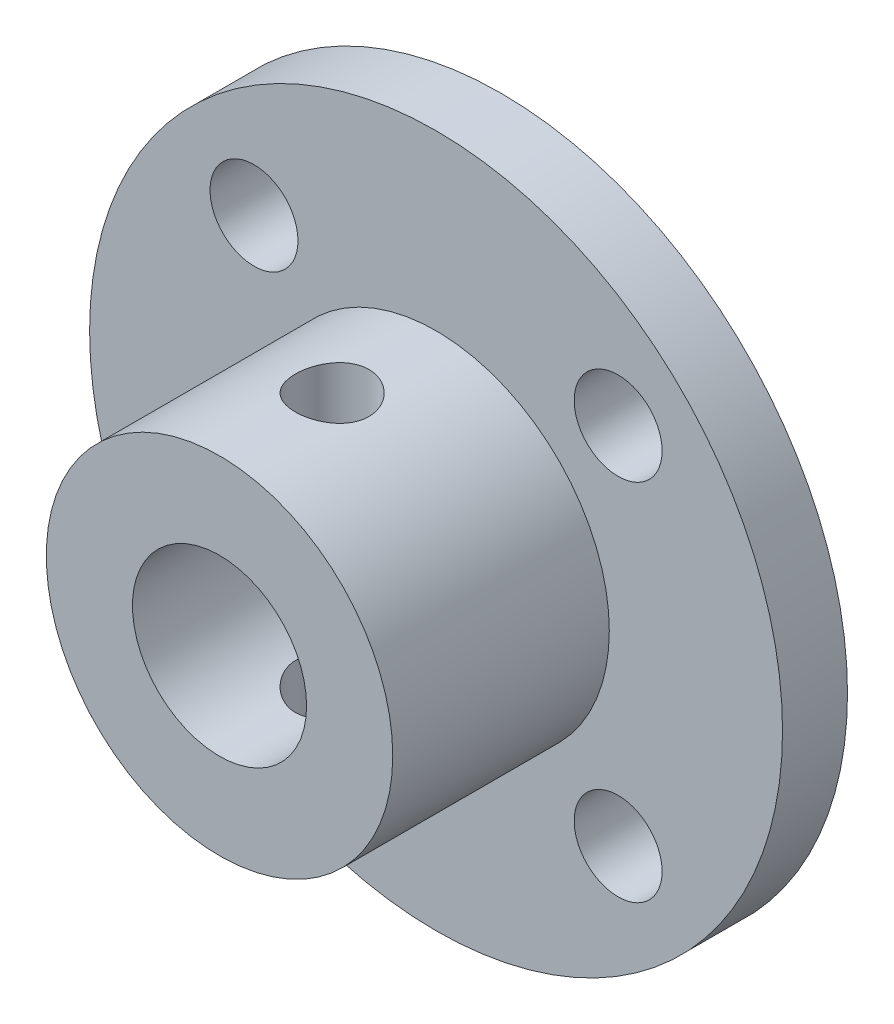
ISO-10303-21;
HEADER;
FILE_DESCRIPTION(('STEP AP214'),'2;1');
FILE_NAME('part.step','',(''),(''),'','','');
FILE_SCHEMA(('AUTOMOTIVE_DESIGN { 1 0 10303 214 1 1 1 1 }'));
ENDSEC;
DATA;
#1=APPLICATION_CONTEXT('core data for automotive mechanical design processes');
#2=APPLICATION_PROTOCOL_DEFINITION('international standard','automotive_design',2000,#1);
#3=PRODUCT_CONTEXT('',#1,'mechanical');
#4=PRODUCT('Part','Part','',(#3));
#5=PRODUCT_RELATED_PRODUCT_CATEGORY('part','',(#4));
#6=PRODUCT_DEFINITION_FORMATION('','',#4);
#7=PRODUCT_DEFINITION_CONTEXT('part definition',#1,'design');
#8=PRODUCT_DEFINITION('design','',#6,#7);
#9=PRODUCT_DEFINITION_SHAPE('','',#8);
#10=(LENGTH_UNIT() NAMED_UNIT(*) SI_UNIT(.MILLI.,.METRE.));
#11=(NAMED_UNIT(*) PLANE_ANGLE_UNIT() SI_UNIT($,.RADIAN.));
#12=(NAMED_UNIT(*) SI_UNIT($,.STERADIAN.) SOLID_ANGLE_UNIT());
#13=UNCERTAINTY_MEASURE_WITH_UNIT(LENGTH_MEASURE(1.E-05),#10,'distance_accuracy_value','');
#14=(GEOMETRIC_REPRESENTATION_CONTEXT(3) GLOBAL_UNCERTAINTY_ASSIGNED_CONTEXT((#13)) GLOBAL_UNIT_ASSIGNED_CONTEXT((#10,
#11,#12)) REPRESENTATION_CONTEXT('',''));
#15=CARTESIAN_POINT('',(0.,0.,0.));
#16=DIRECTION('',(0.,0.,1.));
#17=DIRECTION('',(1.,0.,0.));
#18=AXIS2_PLACEMENT_3D('',#15,#16,#17);
#19=CARTESIAN_POINT('',(0.,0.,3.));
#20=DIRECTION('',(0.,0.,1.));
#21=DIRECTION('',(1.,0.,0.));
#22=AXIS2_PLACEMENT_3D('',#19,#20,#21);
#23=PLANE('',#22);
#24=CARTESIAN_POINT('',(0.,0.,3.));
#25=DIRECTION('',(0.,0.,1.));
#26=DIRECTION('',(1.,0.,0.));
#27=AXIS2_PLACEMENT_3D('',#24,#25,#26);
#28=CIRCLE('',#27,8.);
#29=CARTESIAN_POINT('',(8.,0.,3.));
#30=VERTEX_POINT('',#29);
#31=EDGE_CURVE('E146',#30,#30,#28,.T.);
#32=ORIENTED_EDGE('',*,*,#31,.F.);
#33=EDGE_LOOP('',(#32));
#34=FACE_BOUND('',#33,.T.);
#35=CARTESIAN_POINT('',(8.40749962830804,-8.40749962830806,3.));
#36=DIRECTION('',(0.,0.,1.));
#37=DIRECTION('',(1.,0.,0.));
#38=AXIS2_PLACEMENT_3D('',#35,#36,#37);
#39=CIRCLE('',#38,2.03);
#40=CARTESIAN_POINT('',(10.437499628308,-8.40749962830806,3.));
#41=VERTEX_POINT('',#40);
#42=EDGE_CURVE('E150',#41,#41,#39,.T.);
#43=ORIENTED_EDGE('',*,*,#42,.F.);
#44=EDGE_LOOP('',(#43));
#45=FACE_BOUND('',#44,.T.);
#46=CARTESIAN_POINT('',(-8.40749962830804,8.40749962830806,3.));
#47=DIRECTION('',(0.,0.,1.));
#48=DIRECTION('',(1.,0.,0.));
#49=AXIS2_PLACEMENT_3D('',#46,#47,#48);
#50=CIRCLE('',#49,2.03);
#51=CARTESIAN_POINT('',(-6.37749962830804,8.40749962830806,3.));
#52=VERTEX_POINT('',#51);
#53=EDGE_CURVE('E53',#52,#52,#50,.T.);
#54=ORIENTED_EDGE('',*,*,#53,.F.);
#55=EDGE_LOOP('',(#54));
#56=FACE_BOUND('',#55,.T.);
#57=CARTESIAN_POINT('',(0.,0.,3.));
#58=DIRECTION('',(0.,0.,1.));
#59=DIRECTION('',(1.,0.,0.));
#60=AXIS2_PLACEMENT_3D('',#57,#58,#59);
#61=CIRCLE('',#60,16.);
#62=CARTESIAN_POINT('',(16.,0.,3.));
#63=VERTEX_POINT('',#62);
#64=EDGE_CURVE('E10',#63,#63,#61,.T.);
#65=ORIENTED_EDGE('',*,*,#64,.T.);
#66=EDGE_LOOP('',(#65));
#67=FACE_BOUND('',#66,.T.);
#68=CARTESIAN_POINT('',(8.40749962830806,8.40749962830804,3.));
#69=DIRECTION('',(0.,0.,1.));
#70=DIRECTION('',(1.,0.,0.));
#71=AXIS2_PLACEMENT_3D('',#68,#69,#70);
#72=CIRCLE('',#71,2.03);
#73=CARTESIAN_POINT('',(10.4374996283081,8.40749962830804,3.));
#74=VERTEX_POINT('',#73);
#75=EDGE_CURVE('E154',#74,#74,#72,.T.);
#76=ORIENTED_EDGE('',*,*,#75,.F.);
#77=EDGE_LOOP('',(#76));
#78=FACE_BOUND('',#77,.T.);
#79=CARTESIAN_POINT('',(-8.40749962830806,-8.40749962830804,3.));
#80=DIRECTION('',(0.,0.,1.));
#81=DIRECTION('',(1.,0.,0.));
#82=AXIS2_PLACEMENT_3D('',#79,#80,#81);
#83=CIRCLE('',#82,2.03);
#84=CARTESIAN_POINT('',(-6.37749962830806,-8.40749962830804,3.));
#85=VERTEX_POINT('',#84);
#86=EDGE_CURVE('E140',#85,#85,#83,.T.);
#87=ORIENTED_EDGE('',*,*,#86,.F.);
#88=EDGE_LOOP('',(#87));
#89=FACE_BOUND('',#88,.T.);
#90=ADVANCED_FACE('F35',(#34,#45,#56,#67,#78,#89),#23,.T.);
#91=CARTESIAN_POINT('',(0.,0.,0.));
#92=DIRECTION('',(0.,0.,1.));
#93=DIRECTION('',(1.,0.,0.));
#94=AXIS2_PLACEMENT_3D('',#91,#92,#93);
#95=PLANE('',#94);
#96=CARTESIAN_POINT('',(0.,0.,0.));
#97=DIRECTION('',(0.,0.,1.));
#98=DIRECTION('',(1.,0.,0.));
#99=AXIS2_PLACEMENT_3D('',#96,#97,#98);
#100=CIRCLE('',#99,4.02);
#101=CARTESIAN_POINT('',(4.02,0.,0.));
#102=VERTEX_POINT('',#101);
#103=EDGE_CURVE('E122',#102,#102,#100,.T.);
#104=ORIENTED_EDGE('',*,*,#103,.T.);
#105=EDGE_LOOP('',(#104));
#106=FACE_BOUND('',#105,.T.);
#107=CARTESIAN_POINT('',(0.,0.,0.));
#108=DIRECTION('',(0.,0.,1.));
#109=DIRECTION('',(1.,0.,0.));
#110=AXIS2_PLACEMENT_3D('',#107,#108,#109);
#111=CIRCLE('',#110,16.);
#112=CARTESIAN_POINT('',(16.,0.,0.));
#113=VERTEX_POINT('',#112);
#114=EDGE_CURVE('E48',#113,#113,#111,.T.);
#115=ORIENTED_EDGE('',*,*,#114,.F.);
#116=EDGE_LOOP('',(#115));
#117=FACE_BOUND('',#116,.T.);
#118=CARTESIAN_POINT('',(-8.40749962830804,8.40749962830806,0.));
#119=DIRECTION('',(0.,0.,1.));
#120=DIRECTION('',(1.,0.,0.));
#121=AXIS2_PLACEMENT_3D('',#118,#119,#120);
#122=CIRCLE('',#121,2.03);
#123=CARTESIAN_POINT('',(-6.37749962830804,8.40749962830806,0.));
#124=VERTEX_POINT('',#123);
#125=EDGE_CURVE('E56',#124,#124,#122,.T.);
#126=ORIENTED_EDGE('',*,*,#125,.T.);
#127=EDGE_LOOP('',(#126));
#128=FACE_BOUND('',#127,.T.);
#129=CARTESIAN_POINT('',(8.40749962830806,8.40749962830804,0.));
#130=DIRECTION('',(0.,0.,1.));
#131=DIRECTION('',(1.,0.,0.));
#132=AXIS2_PLACEMENT_3D('',#129,#130,#131);
#133=CIRCLE('',#132,2.03);
#134=CARTESIAN_POINT('',(10.4374996283081,8.40749962830804,0.));
#135=VERTEX_POINT('',#134);
#136=EDGE_CURVE('E131',#135,#135,#133,.T.);
#137=ORIENTED_EDGE('',*,*,#136,.T.);
#138=EDGE_LOOP('',(#137));
#139=FACE_BOUND('',#138,.T.);
#140=CARTESIAN_POINT('',(8.40749962830804,-8.40749962830806,0.));
#141=DIRECTION('',(0.,0.,1.));
#142=DIRECTION('',(1.,0.,0.));
#143=AXIS2_PLACEMENT_3D('',#140,#141,#142);
#144=CIRCLE('',#143,2.03);
#145=CARTESIAN_POINT('',(10.437499628308,-8.40749962830806,0.));
#146=VERTEX_POINT('',#145);
#147=EDGE_CURVE('E135',#146,#146,#144,.T.);
#148=ORIENTED_EDGE('',*,*,#147,.T.);
#149=EDGE_LOOP('',(#148));
#150=FACE_BOUND('',#149,.T.);
#151=CARTESIAN_POINT('',(-8.40749962830806,-8.40749962830804,0.));
#152=DIRECTION('',(0.,0.,1.));
#153=DIRECTION('',(1.,0.,0.));
#154=AXIS2_PLACEMENT_3D('',#151,#152,#153);
#155=CIRCLE('',#154,2.03);
#156=CARTESIAN_POINT('',(-6.37749962830806,-8.40749962830804,0.));
#157=VERTEX_POINT('',#156);
#158=EDGE_CURVE('E138',#157,#157,#155,.T.);
#159=ORIENTED_EDGE('',*,*,#158,.T.);
#160=EDGE_LOOP('',(#159));
#161=FACE_BOUND('',#160,.T.);
#162=ADVANCED_FACE('F111',(#106,#117,#128,#139,#150,#161),#95,.F.);
#163=CARTESIAN_POINT('',(0.,0.,3.));
#164=DIRECTION('',(0.,0.,-1.));
#165=DIRECTION('',(-1.,0.,0.));
#166=AXIS2_PLACEMENT_3D('',#163,#164,#165);
#167=CYLINDRICAL_SURFACE('',#166,16.);
#168=ORIENTED_EDGE('',*,*,#64,.F.);
#169=EDGE_LOOP('',(#168));
#170=FACE_BOUND('',#169,.T.);
#171=ORIENTED_EDGE('',*,*,#114,.T.);
#172=EDGE_LOOP('',(#171));
#173=FACE_BOUND('',#172,.T.);
#174=ADVANCED_FACE('F37',(#170,#173),#167,.T.);
#175=CARTESIAN_POINT('',(-8.40749962830804,8.40749962830806,3.));
#176=DIRECTION('',(0.,0.,-1.));
#177=DIRECTION('',(-1.,0.,0.));
#178=AXIS2_PLACEMENT_3D('',#175,#176,#177);
#179=CYLINDRICAL_SURFACE('',#178,2.03);
#180=ORIENTED_EDGE('',*,*,#53,.T.);
#181=EDGE_LOOP('',(#180));
#182=FACE_BOUND('',#181,.T.);
#183=ORIENTED_EDGE('',*,*,#125,.F.);
#184=EDGE_LOOP('',(#183));
#185=FACE_BOUND('',#184,.T.);
#186=ADVANCED_FACE('F105',(#182,#185),#179,.F.);
#187=CARTESIAN_POINT('',(8.40749962830806,8.40749962830804,3.));
#188=DIRECTION('',(0.,0.,-1.));
#189=DIRECTION('',(-1.,0.,0.));
#190=AXIS2_PLACEMENT_3D('',#187,#188,#189);
#191=CYLINDRICAL_SURFACE('',#190,2.03);
#192=ORIENTED_EDGE('',*,*,#75,.T.);
#193=EDGE_LOOP('',(#192));
#194=FACE_BOUND('',#193,.T.);
#195=ORIENTED_EDGE('',*,*,#136,.F.);
#196=EDGE_LOOP('',(#195));
#197=FACE_BOUND('',#196,.T.);
#198=ADVANCED_FACE('F101',(#194,#197),#191,.F.);
#199=CARTESIAN_POINT('',(8.40749962830804,-8.40749962830806,3.));
#200=DIRECTION('',(0.,0.,-1.));
#201=DIRECTION('',(-1.,0.,0.));
#202=AXIS2_PLACEMENT_3D('',#199,#200,#201);
#203=CYLINDRICAL_SURFACE('',#202,2.03);
#204=ORIENTED_EDGE('',*,*,#42,.T.);
#205=EDGE_LOOP('',(#204));
#206=FACE_BOUND('',#205,.T.);
#207=ORIENTED_EDGE('',*,*,#147,.F.);
#208=EDGE_LOOP('',(#207));
#209=FACE_BOUND('',#208,.T.);
#210=ADVANCED_FACE('F97',(#206,#209),#203,.F.);
#211=CARTESIAN_POINT('',(-8.40749962830806,-8.40749962830804,3.));
#212=DIRECTION('',(0.,0.,-1.));
#213=DIRECTION('',(-1.,0.,0.));
#214=AXIS2_PLACEMENT_3D('',#211,#212,#213);
#215=CYLINDRICAL_SURFACE('',#214,2.03);
#216=ORIENTED_EDGE('',*,*,#86,.T.);
#217=EDGE_LOOP('',(#216));
#218=FACE_BOUND('',#217,.T.);
#219=ORIENTED_EDGE('',*,*,#158,.F.);
#220=EDGE_LOOP('',(#219));
#221=FACE_BOUND('',#220,.T.);
#222=ADVANCED_FACE('F93',(#218,#221),#215,.F.);
#223=CARTESIAN_POINT('',(0.,0.,13.));
#224=DIRECTION('',(0.,0.,1.));
#225=DIRECTION('',(1.,0.,0.));
#226=AXIS2_PLACEMENT_3D('',#223,#224,#225);
#227=PLANE('',#226);
#228=CARTESIAN_POINT('',(0.,0.,13.));
#229=DIRECTION('',(0.,0.,1.));
#230=DIRECTION('',(1.,0.,0.));
#231=AXIS2_PLACEMENT_3D('',#228,#229,#230);
#232=CIRCLE('',#231,8.);
#233=CARTESIAN_POINT('',(8.,0.,13.));
#234=VERTEX_POINT('',#233);
#235=EDGE_CURVE('E141',#234,#234,#232,.T.);
#236=ORIENTED_EDGE('',*,*,#235,.T.);
#237=EDGE_LOOP('',(#236));
#238=FACE_BOUND('',#237,.T.);
#239=CARTESIAN_POINT('',(0.,0.,13.));
#240=DIRECTION('',(0.,0.,1.));
#241=DIRECTION('',(1.,0.,0.));
#242=AXIS2_PLACEMENT_3D('',#239,#240,#241);
#243=CIRCLE('',#242,4.02);
#244=CARTESIAN_POINT('',(4.02,0.,13.));
#245=VERTEX_POINT('',#244);
#246=EDGE_CURVE('E170',#245,#245,#243,.T.);
#247=ORIENTED_EDGE('',*,*,#246,.F.);
#248=EDGE_LOOP('',(#247));
#249=FACE_BOUND('',#248,.T.);
#250=ADVANCED_FACE('F91',(#238,#249),#227,.T.);
#251=CARTESIAN_POINT('',(0.,0.,13.));
#252=DIRECTION('',(0.,0.,-1.));
#253=DIRECTION('',(-1.,0.,0.));
#254=AXIS2_PLACEMENT_3D('',#251,#252,#253);
#255=CYLINDRICAL_SURFACE('',#254,8.);
#256=CARTESIAN_POINT('',(0.,-8.,9.5));
#257=CARTESIAN_POINT('',(0.094352864109376,-7.99999825381919,9.49999668820086));
#258=CARTESIAN_POINT('',(0.188746363933916,-7.99831376764871,9.49211835745931));
#259=CARTESIAN_POINT('',(0.374856619137052,-7.99175664204428,9.46084327272277));
#260=CARTESIAN_POINT('',(0.466571335955327,-7.98688163742332,9.43743500593847));
#261=CARTESIAN_POINT('',(0.644607044539261,-7.97448680665725,9.37586277334904));
#262=CARTESIAN_POINT('',(0.73093340854655,-7.96696966599989,9.33771378623083));
#263=CARTESIAN_POINT('',(0.895956220411311,-7.95010387579121,9.24778954403168));
#264=CARTESIAN_POINT('',(0.974652952574046,-7.94075529452466,9.1960147969588));
#265=CARTESIAN_POINT('',(1.12338231665957,-7.92109356533275,9.07947574247573));
#266=CARTESIAN_POINT('',(1.19328239352828,-7.91076901740381,9.01454417374868));
#267=CARTESIAN_POINT('',(1.32128540584925,-7.89040020478353,8.87389389237994));
#268=CARTESIAN_POINT('',(1.37938733563309,-7.88035596404833,8.79817426110425));
#269=CARTESIAN_POINT('',(1.48272254648283,-7.86157300034688,8.63712624817135));
#270=CARTESIAN_POINT('',(1.52781603059525,-7.85284890658688,8.55170630876561));
#271=CARTESIAN_POINT('',(1.60295797788406,-7.83785707242813,8.3742854364723));
#272=CARTESIAN_POINT('',(1.63300813196716,-7.83158905597756,8.28228524455022));
#273=CARTESIAN_POINT('',(1.67677496265907,-7.82233491943982,8.09574938919768));
#274=CARTESIAN_POINT('',(1.69072561714714,-7.81930183589025,8.0012710028355));
#275=CARTESIAN_POINT('',(1.70262470636021,-7.81671983255703,7.81126977546306));
#276=CARTESIAN_POINT('',(1.70057499406861,-7.81717050932321,7.71574705667514));
#277=CARTESIAN_POINT('',(1.68072012609645,-7.82146253570499,7.52809863039908));
#278=CARTESIAN_POINT('',(1.66318554202181,-7.82524565376059,7.43594276137612));
#279=CARTESIAN_POINT('',(1.61328679965404,-7.83568436364798,7.25591132832695));
#280=CARTESIAN_POINT('',(1.58092185141657,-7.84234010849012,7.16803599258066));
#281=CARTESIAN_POINT('',(1.50202928903875,-7.85783225457993,6.9982929236191));
#282=CARTESIAN_POINT('',(1.45539654423358,-7.86668474760316,6.91647558235358));
#283=CARTESIAN_POINT('',(1.34936612814582,-7.88556291276795,6.76172673000069));
#284=CARTESIAN_POINT('',(1.28996680965747,-7.89558873622223,6.68879636745924));
#285=CARTESIAN_POINT('',(1.15865149235046,-7.91593458691318,6.55233271506611));
#286=CARTESIAN_POINT('',(1.08650512040364,-7.92625644637052,6.48902117285222));
#287=CARTESIAN_POINT('',(0.932503657811405,-7.94584497579641,6.37536124541353));
#288=CARTESIAN_POINT('',(0.850648409946438,-7.95511162867282,6.32501307015137));
#289=CARTESIAN_POINT('',(0.679290440318224,-7.97157312069884,6.23865902563441));
#290=CARTESIAN_POINT('',(0.589773304915644,-7.97876393853956,6.20268094312161));
#291=CARTESIAN_POINT('',(0.405777708848236,-7.99023346841481,6.14633794653508));
#292=CARTESIAN_POINT('',(0.311299930189537,-7.99451257963733,6.12597089217843));
#293=CARTESIAN_POINT('',(0.121968189620489,-7.99962015589428,6.10174768670668));
#294=CARTESIAN_POINT('',(0.0271546646680279,-8.00051195762432,6.09758843943172));
#295=CARTESIAN_POINT('',(-0.161812425450901,-7.99892138507917,6.10507918242289));
#296=CARTESIAN_POINT('',(-0.255966032356656,-7.99643922617581,6.11672816359382));
#297=CARTESIAN_POINT('',(-0.439945394417058,-7.98841948590604,6.15525317829869));
#298=CARTESIAN_POINT('',(-0.529805694549549,-7.98291358265104,6.18197141652734));
#299=CARTESIAN_POINT('',(-0.703769814648035,-7.96946214843525,6.24970229607283));
#300=CARTESIAN_POINT('',(-0.78787316291224,-7.96151641785662,6.29071610703888));
#301=CARTESIAN_POINT('',(-0.949197865300428,-7.94390987783677,6.38651365647989));
#302=CARTESIAN_POINT('',(-1.02631014982036,-7.9342272262525,6.44147696788479));
#303=CARTESIAN_POINT('',(-1.17032575264436,-7.91426767757325,6.56337550018055));
#304=CARTESIAN_POINT('',(-1.23722782271613,-7.90399070803237,6.63031218268615));
#305=CARTESIAN_POINT('',(-1.36011253024019,-7.88378382010522,6.77564458465433));
#306=CARTESIAN_POINT('',(-1.41588588083743,-7.87386300048615,6.85421875891158));
#307=CARTESIAN_POINT('',(-1.51344503617128,-7.85569581040549,7.01979735391589));
#308=CARTESIAN_POINT('',(-1.55523143323132,-7.84744936904269,7.10680141747038));
#309=CARTESIAN_POINT('',(-1.62335674501137,-7.83364042530607,7.28631105849978));
#310=CARTESIAN_POINT('',(-1.64978052371226,-7.82806320883499,7.37878324231216));
#311=CARTESIAN_POINT('',(-1.68668239073081,-7.82019596750101,7.56698803510537));
#312=CARTESIAN_POINT('',(-1.6971628654594,-7.81790545068429,7.66272015394203));
#313=CARTESIAN_POINT('',(-1.70178352829704,-7.81690070371136,7.85262031411688));
#314=CARTESIAN_POINT('',(-1.69625514307892,-7.81811393508567,7.94678006043591));
#315=CARTESIAN_POINT('',(-1.6697527119046,-7.82381660894248,8.13279383397436));
#316=CARTESIAN_POINT('',(-1.6487788272406,-7.82830601721296,8.22464788526102));
#317=CARTESIAN_POINT('',(-1.59213677565847,-7.84002082743682,8.40319749601691));
#318=CARTESIAN_POINT('',(-1.55651425512416,-7.84723772469942,8.48990813082604));
#319=CARTESIAN_POINT('',(-1.47162633515388,-7.86359817202527,8.65617225710488));
#320=CARTESIAN_POINT('',(-1.42235960734807,-7.8727419096607,8.73572505070338));
#321=CARTESIAN_POINT('',(-1.31047131917286,-7.8921442599806,8.88705479274501));
#322=CARTESIAN_POINT('',(-1.24761246845706,-7.90242084346448,8.95865402548973));
#323=CARTESIAN_POINT('',(-1.11080832030079,-7.92280747649253,9.09039709352417));
#324=CARTESIAN_POINT('',(-1.03686047040978,-7.93291748709899,9.15053828416223));
#325=CARTESIAN_POINT('',(-0.87890045770195,-7.95197662079799,9.25835142690585));
#326=CARTESIAN_POINT('',(-0.794777386216196,-7.96091022421651,9.30586376799313));
#327=CARTESIAN_POINT('',(-0.6195696585084,-7.97645538277758,9.38600014547347));
#328=CARTESIAN_POINT('',(-0.528491070254566,-7.98306893437263,9.41863698981324));
#329=CARTESIAN_POINT('',(-0.364401016629736,-7.99201270928772,9.46210574403391));
#330=CARTESIAN_POINT('',(-0.292293891341084,-7.99498974489432,9.47628959451326));
#331=CARTESIAN_POINT('',(-0.146799343288557,-7.99898403060773,9.49523782363742));
#332=CARTESIAN_POINT('',(-0.0734119715423162,-8.00000135862941,9.50000257677079));
#333=CARTESIAN_POINT('',(0.,-8.,9.5));
#334=B_SPLINE_CURVE_WITH_KNOTS('',3,(#256,#257,#258,#259,#260,#261,#262,#263,#264,#265,#266,
#267,#268,#269,#270,#271,#272,#273,#274,#275,#276,#277,#278,#279,#280,#281,#282,#283,#284,#285,
#286,#287,#288,#289,#290,#291,#292,#293,#294,#295,#296,#297,#298,#299,#300,#301,#302,#303,#304,
#305,#306,#307,#308,#309,#310,#311,#312,#313,#314,#315,#316,#317,#318,#319,#320,#321,#322,#323,
#324,#325,#326,#327,#328,#329,#330,#331,#332,#333),.UNSPECIFIED.,.T.,.F.,(4,2,2,2,2,2,2,2,2,2,2,
2,2,2,2,2,2,2,2,2,2,2,2,2,2,2,2,2,2,2,2,2,2,2,2,2,2,2,4),(0.,0.282789928612015,
0.565789732154302,0.84850272033974,1.13120516965376,1.41775675553291,1.70433275668862,
1.99388260681697,2.28339990352966,2.56865437538767,2.85387581275562,3.1342099759094,
3.41455907289321,3.69702577779595,3.97952894983588,4.26778825934102,4.55605223737697,
4.84487094968288,5.13365005765415,5.41700214118225,5.70033613819406,5.98075690918835,
6.26120062931264,6.54545589821496,6.82974589046922,7.1189617792165,7.40816541861832,
7.69575591737955,7.98330336504783,8.26494063340862,8.54657496076726,8.82733826308446,
9.10812890951051,9.39428721079788,9.68051148100067,9.97019758404863,10.259633791186,
10.4796694183905,10.699696297147),.UNSPECIFIED.);
#335=CARTESIAN_POINT('',(0.,-8.,9.5));
#336=VERTEX_POINT('',#335);
#337=EDGE_CURVE('E82',#336,#336,#334,.T.);
#338=ORIENTED_EDGE('',*,*,#337,.T.);
#339=EDGE_LOOP('',(#338));
#340=FACE_BOUND('',#339,.T.);
#341=CARTESIAN_POINT('',(0.,8.,9.5));
#342=CARTESIAN_POINT('',(-0.0943528641093741,7.99999825381919,9.49999668820086));
#343=CARTESIAN_POINT('',(-0.188746363933914,7.99831376764871,9.49211835745931));
#344=CARTESIAN_POINT('',(-0.37485661913705,7.99175664204428,9.46084327272277));
#345=CARTESIAN_POINT('',(-0.466571335955325,7.98688163742332,9.43743500593847));
#346=CARTESIAN_POINT('',(-0.644607044539259,7.97448680665725,9.37586277334904));
#347=CARTESIAN_POINT('',(-0.730933408546548,7.96696966599989,9.33771378623083));
#348=CARTESIAN_POINT('',(-0.895956220411309,7.95010387579121,9.24778954403168));
#349=CARTESIAN_POINT('',(-0.974652952574045,7.94075529452466,9.1960147969588));
#350=CARTESIAN_POINT('',(-1.12338231665957,7.92109356533275,9.07947574247573));
#351=CARTESIAN_POINT('',(-1.19328239352827,7.91076901740381,9.01454417374868));
#352=CARTESIAN_POINT('',(-1.32128540584925,7.89040020478353,8.87389389237994));
#353=CARTESIAN_POINT('',(-1.37938733563309,7.88035596404833,8.79817426110425));
#354=CARTESIAN_POINT('',(-1.48272254648283,7.86157300034688,8.63712624817135));
#355=CARTESIAN_POINT('',(-1.52781603059525,7.85284890658688,8.55170630876561));
#356=CARTESIAN_POINT('',(-1.60295797788406,7.83785707242813,8.3742854364723));
#357=CARTESIAN_POINT('',(-1.63300813196715,7.83158905597756,8.28228524455022));
#358=CARTESIAN_POINT('',(-1.67677496265907,7.82233491943982,8.09574938919768));
#359=CARTESIAN_POINT('',(-1.69072561714714,7.81930183589025,8.0012710028355));
#360=CARTESIAN_POINT('',(-1.70262470636021,7.81671983255703,7.81126977546306));
#361=CARTESIAN_POINT('',(-1.70057499406861,7.81717050932321,7.71574705667514));
#362=CARTESIAN_POINT('',(-1.68072012609645,7.82146253570499,7.52809863039908));
#363=CARTESIAN_POINT('',(-1.6631855420218,7.82524565376059,7.43594276137612));
#364=CARTESIAN_POINT('',(-1.61328679965404,7.83568436364798,7.25591132832695));
#365=CARTESIAN_POINT('',(-1.58092185141657,7.84234010849012,7.16803599258066));
#366=CARTESIAN_POINT('',(-1.50202928903875,7.85783225457993,6.9982929236191));
#367=CARTESIAN_POINT('',(-1.45539654423358,7.86668474760316,6.91647558235358));
#368=CARTESIAN_POINT('',(-1.34936612814582,7.88556291276795,6.76172673000069));
#369=CARTESIAN_POINT('',(-1.28996680965747,7.89558873622223,6.68879636745924));
#370=CARTESIAN_POINT('',(-1.15865149235045,7.91593458691318,6.55233271506611));
#371=CARTESIAN_POINT('',(-1.08650512040364,7.92625644637053,6.48902117285222));
#372=CARTESIAN_POINT('',(-0.932503657811401,7.94584497579641,6.37536124541353));
#373=CARTESIAN_POINT('',(-0.850648409946436,7.95511162867282,6.32501307015137));
#374=CARTESIAN_POINT('',(-0.679290440318222,7.97157312069884,6.23865902563441));
#375=CARTESIAN_POINT('',(-0.589773304915641,7.97876393853956,6.20268094312161));
#376=CARTESIAN_POINT('',(-0.405777708848233,7.99023346841481,6.14633794653508));
#377=CARTESIAN_POINT('',(-0.311299930189534,7.99451257963733,6.12597089217843));
#378=CARTESIAN_POINT('',(-0.121968189620485,7.99962015589428,6.10174768670668));
#379=CARTESIAN_POINT('',(-0.0271546646680241,8.00051195762433,6.09758843943172));
#380=CARTESIAN_POINT('',(0.161812425450905,7.99892138507917,6.10507918242289));
#381=CARTESIAN_POINT('',(0.255966032356659,7.99643922617581,6.11672816359382));
#382=CARTESIAN_POINT('',(0.439945394417061,7.98841948590604,6.15525317829869));
#383=CARTESIAN_POINT('',(0.529805694549552,7.98291358265104,6.18197141652734));
#384=CARTESIAN_POINT('',(0.703769814648038,7.96946214843525,6.24970229607283));
#385=CARTESIAN_POINT('',(0.787873162912243,7.96151641785662,6.29071610703888));
#386=CARTESIAN_POINT('',(0.949197865300431,7.94390987783677,6.38651365647989));
#387=CARTESIAN_POINT('',(1.02631014982036,7.9342272262525,6.44147696788479));
#388=CARTESIAN_POINT('',(1.17032575264436,7.91426767757325,6.56337550018055));
#389=CARTESIAN_POINT('',(1.23722782271613,7.90399070803237,6.63031218268615));
#390=CARTESIAN_POINT('',(1.36011253024019,7.88378382010522,6.77564458465433));
#391=CARTESIAN_POINT('',(1.41588588083743,7.87386300048615,6.85421875891158));
#392=CARTESIAN_POINT('',(1.51344503617128,7.85569581040549,7.01979735391589));
#393=CARTESIAN_POINT('',(1.55523143323132,7.84744936904269,7.10680141747038));
#394=CARTESIAN_POINT('',(1.62335674501137,7.83364042530607,7.28631105849978));
#395=CARTESIAN_POINT('',(1.64978052371226,7.82806320883499,7.37878324231216));
#396=CARTESIAN_POINT('',(1.68668239073081,7.82019596750102,7.56698803510537));
#397=CARTESIAN_POINT('',(1.6971628654594,7.8179054506843,7.66272015394203));
#398=CARTESIAN_POINT('',(1.70178352829705,7.81690070371136,7.85262031411688));
#399=CARTESIAN_POINT('',(1.69625514307892,7.81811393508567,7.94678006043592));
#400=CARTESIAN_POINT('',(1.6697527119046,7.82381660894248,8.13279383397436));
#401=CARTESIAN_POINT('',(1.6487788272406,7.82830601721296,8.22464788526102));
#402=CARTESIAN_POINT('',(1.59213677565847,7.84002082743682,8.40319749601691));
#403=CARTESIAN_POINT('',(1.55651425512417,7.84723772469942,8.48990813082604));
#404=CARTESIAN_POINT('',(1.47162633515388,7.86359817202527,8.65617225710488));
#405=CARTESIAN_POINT('',(1.42235960734808,7.8727419096607,8.73572505070338));
#406=CARTESIAN_POINT('',(1.31047131917286,7.8921442599806,8.88705479274501));
#407=CARTESIAN_POINT('',(1.24761246845706,7.90242084346448,8.95865402548973));
#408=CARTESIAN_POINT('',(1.11080832030079,7.92280747649253,9.09039709352417));
#409=CARTESIAN_POINT('',(1.03686047040978,7.93291748709899,9.15053828416223));
#410=CARTESIAN_POINT('',(0.878900457701951,7.95197662079799,9.25835142690585));
#411=CARTESIAN_POINT('',(0.794777386216197,7.9609102242165,9.30586376799313));
#412=CARTESIAN_POINT('',(0.619569658508401,7.97645538277758,9.38600014547347));
#413=CARTESIAN_POINT('',(0.528491070254568,7.98306893437263,9.41863698981324));
#414=CARTESIAN_POINT('',(0.364401016629738,7.99201270928772,9.46210574403391));
#415=CARTESIAN_POINT('',(0.292293891341086,7.99498974489432,9.47628959451326));
#416=CARTESIAN_POINT('',(0.146799343288559,7.99898403060773,9.49523782363742));
#417=CARTESIAN_POINT('',(0.073411971542318,8.00000135862941,9.50000257677079));
#418=CARTESIAN_POINT('',(0.,8.,9.5));
#419=B_SPLINE_CURVE_WITH_KNOTS('',3,(#341,#342,#343,#344,#345,#346,#347,#348,#349,#350,#351,
#352,#353,#354,#355,#356,#357,#358,#359,#360,#361,#362,#363,#364,#365,#366,#367,#368,#369,#370,
#371,#372,#373,#374,#375,#376,#377,#378,#379,#380,#381,#382,#383,#384,#385,#386,#387,#388,#389,
#390,#391,#392,#393,#394,#395,#396,#397,#398,#399,#400,#401,#402,#403,#404,#405,#406,#407,#408,
#409,#410,#411,#412,#413,#414,#415,#416,#417,#418),.UNSPECIFIED.,.T.,.F.,(4,2,2,2,2,2,2,2,2,2,2,
2,2,2,2,2,2,2,2,2,2,2,2,2,2,2,2,2,2,2,2,2,2,2,2,2,2,2,4),(0.,0.282789928612016,
0.565789732154302,0.848502720339741,1.13120516965376,1.41775675553291,1.70433275668862,
1.99388260681697,2.28339990352966,2.56865437538768,2.85387581275562,3.1342099759094,
3.41455907289321,3.69702577779596,3.97952894983588,4.26778825934102,4.55605223737697,
4.84487094968288,5.13365005765415,5.41700214118225,5.70033613819407,5.98075690918835,
6.26120062931264,6.54545589821496,6.82974589046922,7.1189617792165,7.40816541861832,
7.69575591737955,7.98330336504783,8.26494063340863,8.54657496076727,8.82733826308446,
9.10812890951051,9.39428721079789,9.68051148100067,9.97019758404863,10.259633791186,
10.4796694183905,10.699696297147),.UNSPECIFIED.);
#420=CARTESIAN_POINT('',(0.,8.,9.5));
#421=VERTEX_POINT('',#420);
#422=EDGE_CURVE('E76',#421,#421,#419,.T.);
#423=ORIENTED_EDGE('',*,*,#422,.T.);
#424=EDGE_LOOP('',(#423));
#425=FACE_BOUND('',#424,.T.);
#426=ORIENTED_EDGE('',*,*,#235,.F.);
#427=EDGE_LOOP('',(#426));
#428=FACE_BOUND('',#427,.T.);
#429=ORIENTED_EDGE('',*,*,#31,.T.);
#430=EDGE_LOOP('',(#429));
#431=FACE_BOUND('',#430,.T.);
#432=ADVANCED_FACE('F87',(#340,#425,#428,#431),#255,.T.);
#433=CARTESIAN_POINT('',(0.,0.,13.));
#434=DIRECTION('',(0.,0.,-1.));
#435=DIRECTION('',(-1.,0.,0.));
#436=AXIS2_PLACEMENT_3D('',#433,#434,#435);
#437=CYLINDRICAL_SURFACE('',#436,4.02);
#438=CARTESIAN_POINT('',(0.,-4.02,9.5));
#439=CARTESIAN_POINT('',(0.0909465709615085,-4.01999230368974,9.49998982025683));
#440=CARTESIAN_POINT('',(0.182030097068295,-4.0168781404236,9.49265871712931));
#441=CARTESIAN_POINT('',(0.361610326001167,-4.00472115898081,9.46359742135356));
#442=CARTESIAN_POINT('',(0.450099781181276,-3.99566312876989,9.44183028127962));
#443=CARTESIAN_POINT('',(0.621597664467763,-3.97259042433652,9.38484985587861));
#444=CARTESIAN_POINT('',(0.704623754311563,-3.95859275800871,9.34968267613035));
#445=CARTESIAN_POINT('',(0.863515497218187,-3.92699785286565,9.26709363042796));
#446=CARTESIAN_POINT('',(0.939383191340547,-3.90940164465576,9.21967527213164));
#447=CARTESIAN_POINT('',(1.08582673832591,-3.87135262186598,9.1113578980173));
#448=CARTESIAN_POINT('',(1.1559865788021,-3.85080444546628,9.04993025341643));
#449=CARTESIAN_POINT('',(1.28536821889996,-3.80957327116624,8.91645660383064));
#450=CARTESIAN_POINT('',(1.34458409787448,-3.78889020651914,8.84440488893059));
#451=CARTESIAN_POINT('',(1.45338653055841,-3.74854763830244,8.68727378399652));
#452=CARTESIAN_POINT('',(1.50232740571975,-3.72899424547919,8.60171718533281));
#453=CARTESIAN_POINT('',(1.58493745480004,-3.69464338489026,8.42264080834948));
#454=CARTESIAN_POINT('',(1.61861472891473,-3.67984339577261,8.32912528510061));
#455=CARTESIAN_POINT('',(1.6680105565199,-3.65771036757911,8.1415746999155));
#456=CARTESIAN_POINT('',(1.68453108632015,-3.65004580963473,8.04779151878225));
#457=CARTESIAN_POINT('',(1.7016449968738,-3.64210144083342,7.85849518820012));
#458=CARTESIAN_POINT('',(1.70224754519426,-3.64181737936395,7.76298306621366));
#459=CARTESIAN_POINT('',(1.68811109100044,-3.64838639426413,7.58104146582639));
#460=CARTESIAN_POINT('',(1.67458665805805,-3.65467445683152,7.49449306777539));
#461=CARTESIAN_POINT('',(1.63462206468332,-3.67272191897773,7.32503423534549));
#462=CARTESIAN_POINT('',(1.60817934213183,-3.68448240389482,7.24212452619404));
#463=CARTESIAN_POINT('',(1.54261007783596,-3.7124173687322,7.08017062119996));
#464=CARTESIAN_POINT('',(1.50322220240905,-3.7286816025461,7.00124840948597));
#465=CARTESIAN_POINT('',(1.41306607828046,-3.76377211173452,6.85082062243985));
#466=CARTESIAN_POINT('',(1.362293267379,-3.78259941299626,6.77931803716761));
#467=CARTESIAN_POINT('',(1.24560731054935,-3.8226934776886,6.63918882565187));
#468=CARTESIAN_POINT('',(1.17875935279003,-3.84402971583072,6.57135824903976));
#469=CARTESIAN_POINT('',(1.03443204215562,-3.88535472590001,6.44759858005463));
#470=CARTESIAN_POINT('',(0.956950056043008,-3.90534316224553,6.39167244428075));
#471=CARTESIAN_POINT('',(0.79107296006061,-3.9423328762165,6.29209356936899));
#472=CARTESIAN_POINT('',(0.70245752584846,-3.95924927025281,6.2487739630176));
#473=CARTESIAN_POINT('',(0.518298500545569,-3.9875333964048,6.17793835077453));
#474=CARTESIAN_POINT('',(0.422758891670749,-3.99890428920338,6.15041334109895));
#475=CARTESIAN_POINT('',(0.234108030174937,-4.01422027904357,6.11363598902092));
#476=CARTESIAN_POINT('',(0.14124008444941,-4.01859851550742,6.10331591069606));
#477=CARTESIAN_POINT('',(-0.0449967066415198,-4.02082542018481,6.09804653639442));
#478=CARTESIAN_POINT('',(-0.138365394361679,-4.01867603534748,6.10309265724735));
#479=CARTESIAN_POINT('',(-0.317891305832221,-4.0083689304611,6.127656402201));
#480=CARTESIAN_POINT('',(-0.404172395575119,-4.00052604798607,6.14641606393324));
#481=CARTESIAN_POINT('',(-0.572263077308366,-3.97996101542514,6.19681041490158));
#482=CARTESIAN_POINT('',(-0.654072107214697,-3.96723825360088,6.22844671837518));
#483=CARTESIAN_POINT('',(-0.813778201295967,-3.93763505333721,6.30472706990011));
#484=CARTESIAN_POINT('',(-0.891473860595801,-3.92063738646121,6.34974581510521));
#485=CARTESIAN_POINT('',(-1.03848727572001,-3.88428734221262,6.45110252442633));
#486=CARTESIAN_POINT('',(-1.10780147036607,-3.86493397089009,6.50744527309026));
#487=CARTESIAN_POINT('',(-1.24144356924004,-3.82419292938176,6.63469177628637));
#488=CARTESIAN_POINT('',(-1.30503038915284,-3.80276029742548,6.70636144478736));
#489=CARTESIAN_POINT('',(-1.41949055931202,-3.76153647170229,6.85968044301021));
#490=CARTESIAN_POINT('',(-1.47036069252254,-3.74174569413193,6.9413322902355));
#491=CARTESIAN_POINT('',(-1.55858748231936,-3.70587633310054,7.11416936112951));
#492=CARTESIAN_POINT('',(-1.59571292809384,-3.6898627773524,7.20548711569275));
#493=CARTESIAN_POINT('',(-1.65373542279358,-3.66423032661131,7.39397030856224));
#494=CARTESIAN_POINT('',(-1.67464639789164,-3.65460594515289,7.49113065135846));
#495=CARTESIAN_POINT('',(-1.69824292766056,-3.64369653293086,7.68029259978724));
#496=CARTESIAN_POINT('',(-1.70223471245721,-3.64181416336371,7.77209746213379));
#497=CARTESIAN_POINT('',(-1.69538817415903,-3.64500672918337,7.9550194984765));
#498=CARTESIAN_POINT('',(-1.68455229800323,-3.65008051662862,8.04613678344541));
#499=CARTESIAN_POINT('',(-1.64946612008805,-3.66606078056477,8.22045191419631));
#500=CARTESIAN_POINT('',(-1.62590471241613,-3.67666683741411,8.30381863787106));
#501=CARTESIAN_POINT('',(-1.56672120261425,-3.70227209480498,8.46542888486329));
#502=CARTESIAN_POINT('',(-1.53109569063173,-3.71727253723347,8.543670952255));
#503=CARTESIAN_POINT('',(-1.44629129039264,-3.75111238054553,8.69803371120305));
#504=CARTESIAN_POINT('',(-1.39641716810882,-3.77013036820742,8.773732539901));
#505=CARTESIAN_POINT('',(-1.28548907267739,-3.80938009840335,8.91609494573185));
#506=CARTESIAN_POINT('',(-1.22443103839147,-3.82961228003922,8.98275522540588));
#507=CARTESIAN_POINT('',(-1.08736630807589,-3.87085649171054,9.11036319240571));
#508=CARTESIAN_POINT('',(-1.01057636159529,-3.89181100063599,9.17049218650775));
#509=CARTESIAN_POINT('',(-0.847227234318258,-3.93060331926486,9.27706216661533));
#510=CARTESIAN_POINT('',(-0.760663642827856,-3.94843971248384,9.32349693821324));
#511=CARTESIAN_POINT('',(-0.581458673092186,-3.97874829013246,9.4003964474687));
#512=CARTESIAN_POINT('',(-0.48893280916948,-3.99129961539799,9.43109841274749));
#513=CARTESIAN_POINT('',(-0.299550374162889,-4.00994370431992,9.47621085112534));
#514=CARTESIAN_POINT('',(-0.202708277063995,-4.01605657642832,9.49067205648369));
#515=CARTESIAN_POINT('',(-0.070323880640124,-4.01954133841611,9.49891292991653));
#516=CARTESIAN_POINT('',(-0.0351721820736895,-4.02000297642916,9.50000393685849));
#517=CARTESIAN_POINT('',(0.,-4.02,9.5));
#518=B_SPLINE_CURVE_WITH_KNOTS('',3,(#438,#439,#440,#441,#442,#443,#444,#445,#446,#447,#448,
#449,#450,#451,#452,#453,#454,#455,#456,#457,#458,#459,#460,#461,#462,#463,#464,#465,#466,#467,
#468,#469,#470,#471,#472,#473,#474,#475,#476,#477,#478,#479,#480,#481,#482,#483,#484,#485,#486,
#487,#488,#489,#490,#491,#492,#493,#494,#495,#496,#497,#498,#499,#500,#501,#502,#503,#504,#505,
#506,#507,#508,#509,#510,#511,#512,#513,#514,#515,#516,#517),.UNSPECIFIED.,.T.,.F.,(4,2,2,2,2,2,
2,2,2,2,2,2,2,2,2,2,2,2,2,2,2,2,2,2,2,2,2,2,2,2,2,2,2,2,2,2,2,2,2,4),(0.,0.272737385777405,
0.546175520274483,0.81868120834595,1.09110896110017,1.37633432886807,1.66171355379657,
1.96165736162551,2.26144180623717,2.54647833386689,2.83135069818918,3.0935995419725,
3.35590041940334,3.62386018508285,3.89192752077235,4.18339777133439,4.47494032750138,
4.77360362844638,5.07209650540699,5.35126235336712,5.63034494461065,5.89506788150848,
6.15982401474601,6.43283217930329,6.70595593699409,6.99915679895421,7.29243175924971,
7.59043730658809,7.88818662060089,8.16247503485668,8.43671819004584,8.69741793606657,
8.95819142902048,9.23490159119582,9.51171243317797,9.80955227536703,10.107527069367,
10.4008658600672,10.6932857592656,10.798762732058),.UNSPECIFIED.);
#519=CARTESIAN_POINT('',(0.,-4.02,9.5));
#520=VERTEX_POINT('',#519);
#521=EDGE_CURVE('E39',#520,#520,#518,.T.);
#522=ORIENTED_EDGE('',*,*,#521,.F.);
#523=EDGE_LOOP('',(#522));
#524=FACE_BOUND('',#523,.T.);
#525=CARTESIAN_POINT('',(0.,4.02,9.5));
#526=CARTESIAN_POINT('',(-0.0909465709615066,4.01999230368974,9.49998982025683));
#527=CARTESIAN_POINT('',(-0.182030097068293,4.0168781404236,9.49265871712931));
#528=CARTESIAN_POINT('',(-0.361610326001165,4.00472115898081,9.46359742135356));
#529=CARTESIAN_POINT('',(-0.450099781181274,3.99566312876989,9.44183028127962));
#530=CARTESIAN_POINT('',(-0.621597664467762,3.97259042433652,9.38484985587861));
#531=CARTESIAN_POINT('',(-0.704623754311561,3.95859275800871,9.34968267613035));
#532=CARTESIAN_POINT('',(-0.863515497218184,3.92699785286565,9.26709363042796));
#533=CARTESIAN_POINT('',(-0.939383191340545,3.90940164465576,9.21967527213164));
#534=CARTESIAN_POINT('',(-1.08582673832591,3.87135262186598,9.1113578980173));
#535=CARTESIAN_POINT('',(-1.15598657880209,3.85080444546628,9.04993025341643));
#536=CARTESIAN_POINT('',(-1.28536821889995,3.80957327116624,8.91645660383064));
#537=CARTESIAN_POINT('',(-1.34458409787448,3.78889020651914,8.84440488893059));
#538=CARTESIAN_POINT('',(-1.45338653055841,3.74854763830244,8.68727378399652));
#539=CARTESIAN_POINT('',(-1.50232740571975,3.72899424547919,8.60171718533281));
#540=CARTESIAN_POINT('',(-1.58493745480004,3.69464338489026,8.42264080834949));
#541=CARTESIAN_POINT('',(-1.61861472891473,3.67984339577261,8.32912528510061));
#542=CARTESIAN_POINT('',(-1.6680105565199,3.65771036757911,8.1415746999155));
#543=CARTESIAN_POINT('',(-1.68453108632015,3.65004580963473,8.04779151878225));
#544=CARTESIAN_POINT('',(-1.7016449968738,3.64210144083342,7.85849518820012));
#545=CARTESIAN_POINT('',(-1.70224754519426,3.64181737936395,7.76298306621366));
#546=CARTESIAN_POINT('',(-1.68811109100044,3.64838639426413,7.58104146582639));
#547=CARTESIAN_POINT('',(-1.67458665805805,3.65467445683152,7.49449306777539));
#548=CARTESIAN_POINT('',(-1.63462206468332,3.67272191897773,7.32503423534549));
#549=CARTESIAN_POINT('',(-1.60817934213183,3.68448240389482,7.24212452619404));
#550=CARTESIAN_POINT('',(-1.54261007783596,3.7124173687322,7.08017062119996));
#551=CARTESIAN_POINT('',(-1.50322220240905,3.7286816025461,7.00124840948597));
#552=CARTESIAN_POINT('',(-1.41306607828045,3.76377211173452,6.85082062243985));
#553=CARTESIAN_POINT('',(-1.362293267379,3.78259941299626,6.77931803716761));
#554=CARTESIAN_POINT('',(-1.24560731054935,3.8226934776886,6.63918882565187));
#555=CARTESIAN_POINT('',(-1.17875935279002,3.84402971583072,6.57135824903976));
#556=CARTESIAN_POINT('',(-1.03443204215562,3.88535472590001,6.44759858005462));
#557=CARTESIAN_POINT('',(-0.956950056043005,3.90534316224553,6.39167244428075));
#558=CARTESIAN_POINT('',(-0.791072960060607,3.9423328762165,6.29209356936899));
#559=CARTESIAN_POINT('',(-0.702457525848456,3.95924927025281,6.2487739630176));
#560=CARTESIAN_POINT('',(-0.518298500545566,3.9875333964048,6.17793835077453));
#561=CARTESIAN_POINT('',(-0.422758891670746,3.99890428920338,6.15041334109895));
#562=CARTESIAN_POINT('',(-0.234108030174935,4.01422027904357,6.11363598902092));
#563=CARTESIAN_POINT('',(-0.141240084449408,4.01859851550742,6.10331591069606));
#564=CARTESIAN_POINT('',(0.0449967066415222,4.02082542018481,6.09804653639442));
#565=CARTESIAN_POINT('',(0.138365394361682,4.01867603534748,6.10309265724735));
#566=CARTESIAN_POINT('',(0.317891305832223,4.0083689304611,6.127656402201));
#567=CARTESIAN_POINT('',(0.404172395575122,4.00052604798607,6.14641606393324));
#568=CARTESIAN_POINT('',(0.572263077308369,3.97996101542514,6.19681041490158));
#569=CARTESIAN_POINT('',(0.654072107214699,3.96723825360088,6.22844671837518));
#570=CARTESIAN_POINT('',(0.813778201295969,3.93763505333721,6.30472706990011));
#571=CARTESIAN_POINT('',(0.891473860595803,3.9206373864612,6.34974581510521));
#572=CARTESIAN_POINT('',(1.03848727572001,3.88428734221262,6.45110252442633));
#573=CARTESIAN_POINT('',(1.10780147036607,3.86493397089009,6.50744527309026));
#574=CARTESIAN_POINT('',(1.24144356924004,3.82419292938176,6.63469177628637));
#575=CARTESIAN_POINT('',(1.30503038915284,3.80276029742548,6.70636144478736));
#576=CARTESIAN_POINT('',(1.41949055931202,3.76153647170229,6.85968044301021));
#577=CARTESIAN_POINT('',(1.47036069252254,3.74174569413193,6.9413322902355));
#578=CARTESIAN_POINT('',(1.55858748231937,3.70587633310054,7.11416936112952));
#579=CARTESIAN_POINT('',(1.59571292809384,3.6898627773524,7.20548711569275));
#580=CARTESIAN_POINT('',(1.65373542279358,3.66423032661131,7.39397030856224));
#581=CARTESIAN_POINT('',(1.67464639789165,3.65460594515289,7.49113065135847));
#582=CARTESIAN_POINT('',(1.69824292766056,3.64369653293086,7.68029259978725));
#583=CARTESIAN_POINT('',(1.70223471245721,3.64181416336371,7.77209746213379));
#584=CARTESIAN_POINT('',(1.69538817415903,3.64500672918337,7.95501949847651));
#585=CARTESIAN_POINT('',(1.68455229800324,3.65008051662862,8.04613678344541));
#586=CARTESIAN_POINT('',(1.64946612008805,3.66606078056477,8.22045191419631));
#587=CARTESIAN_POINT('',(1.62590471241613,3.67666683741411,8.30381863787106));
#588=CARTESIAN_POINT('',(1.56672120261425,3.70227209480498,8.46542888486329));
#589=CARTESIAN_POINT('',(1.53109569063173,3.71727253723347,8.543670952255));
#590=CARTESIAN_POINT('',(1.44629129039264,3.75111238054553,8.69803371120305));
#591=CARTESIAN_POINT('',(1.39641716810883,3.77013036820742,8.773732539901));
#592=CARTESIAN_POINT('',(1.2854890726774,3.80938009840335,8.91609494573185));
#593=CARTESIAN_POINT('',(1.22443103839147,3.82961228003922,8.98275522540588));
#594=CARTESIAN_POINT('',(1.08736630807589,3.87085649171054,9.11036319240571));
#595=CARTESIAN_POINT('',(1.01057636159529,3.89181100063599,9.17049218650775));
#596=CARTESIAN_POINT('',(0.847227234318259,3.93060331926486,9.27706216661532));
#597=CARTESIAN_POINT('',(0.760663642827857,3.94843971248384,9.32349693821324));
#598=CARTESIAN_POINT('',(0.581458673092188,3.97874829013246,9.4003964474687));
#599=CARTESIAN_POINT('',(0.488932809169481,3.99129961539799,9.43109841274749));
#600=CARTESIAN_POINT('',(0.29955037416289,4.00994370431992,9.47621085112534));
#601=CARTESIAN_POINT('',(0.202708277063996,4.01605657642832,9.49067205648369));
#602=CARTESIAN_POINT('',(0.0703238806401254,4.01954133841611,9.49891292991653));
#603=CARTESIAN_POINT('',(0.0351721820736912,4.02000297642916,9.50000393685849));
#604=CARTESIAN_POINT('',(0.,4.02,9.5));
#605=B_SPLINE_CURVE_WITH_KNOTS('',3,(#525,#526,#527,#528,#529,#530,#531,#532,#533,#534,#535,
#536,#537,#538,#539,#540,#541,#542,#543,#544,#545,#546,#547,#548,#549,#550,#551,#552,#553,#554,
#555,#556,#557,#558,#559,#560,#561,#562,#563,#564,#565,#566,#567,#568,#569,#570,#571,#572,#573,
#574,#575,#576,#577,#578,#579,#580,#581,#582,#583,#584,#585,#586,#587,#588,#589,#590,#591,#592,
#593,#594,#595,#596,#597,#598,#599,#600,#601,#602,#603,#604),.UNSPECIFIED.,.T.,.F.,(4,2,2,2,2,2,
2,2,2,2,2,2,2,2,2,2,2,2,2,2,2,2,2,2,2,2,2,2,2,2,2,2,2,2,2,2,2,2,2,4),(0.,0.272737385777405,
0.546175520274483,0.81868120834595,1.09110896110017,1.37633432886807,1.66171355379656,
1.96165736162551,2.26144180623717,2.54647833386689,2.83135069818918,3.0935995419725,
3.35590041940334,3.62386018508285,3.89192752077235,4.18339777133439,4.47494032750138,
4.77360362844639,5.07209650540699,5.35126235336712,5.63034494461065,5.89506788150848,
6.15982401474601,6.4328321793033,6.70595593699409,6.99915679895421,7.29243175924971,
7.59043730658809,7.88818662060089,8.16247503485668,8.43671819004585,8.69741793606657,
8.95819142902048,9.23490159119583,9.51171243317798,9.80955227536703,10.107527069367,
10.4008658600672,10.6932857592656,10.798762732058),.UNSPECIFIED.);
#606=CARTESIAN_POINT('',(0.,4.02,9.5));
#607=VERTEX_POINT('',#606);
#608=EDGE_CURVE('E58',#607,#607,#605,.T.);
#609=ORIENTED_EDGE('',*,*,#608,.F.);
#610=EDGE_LOOP('',(#609));
#611=FACE_BOUND('',#610,.T.);
#612=ORIENTED_EDGE('',*,*,#246,.T.);
#613=EDGE_LOOP('',(#612));
#614=FACE_BOUND('',#613,.T.);
#615=ORIENTED_EDGE('',*,*,#103,.F.);
#616=EDGE_LOOP('',(#615));
#617=FACE_BOUND('',#616,.T.);
#618=ADVANCED_FACE('F63',(#524,#611,#614,#617),#437,.F.);
#619=CARTESIAN_POINT('',(0.,-16.,7.8));
#620=DIRECTION('',(0.,1.,0.));
#621=DIRECTION('',(0.,0.,1.));
#622=AXIS2_PLACEMENT_3D('',#619,#620,#621);
#623=CYLINDRICAL_SURFACE('',#622,1.7);
#624=ORIENTED_EDGE('',*,*,#608,.T.);
#625=EDGE_LOOP('',(#624));
#626=FACE_BOUND('',#625,.T.);
#627=ORIENTED_EDGE('',*,*,#422,.F.);
#628=EDGE_LOOP('',(#627));
#629=FACE_BOUND('',#628,.T.);
#630=ADVANCED_FACE('F69',(#626,#629),#623,.F.);
#631=ORIENTED_EDGE('',*,*,#521,.T.);
#632=EDGE_LOOP('',(#631));
#633=FACE_BOUND('',#632,.T.);
#634=ORIENTED_EDGE('',*,*,#337,.F.);
#635=EDGE_LOOP('',(#634));
#636=FACE_BOUND('',#635,.T.);
#637=ADVANCED_FACE('F66',(#633,#636),#623,.F.);
#638=CLOSED_SHELL('',(#90,#162,#174,#186,#198,#210,#222,#250,#432,#618,#630,#637));
#639=MANIFOLD_SOLID_BREP('B2',#638);
#640=ADVANCED_BREP_SHAPE_REPRESENTATION('',(#18,#639),#14);
#641=SHAPE_DEFINITION_REPRESENTATION(#9,#640);
ENDSEC;
END-ISO-10303-21;
